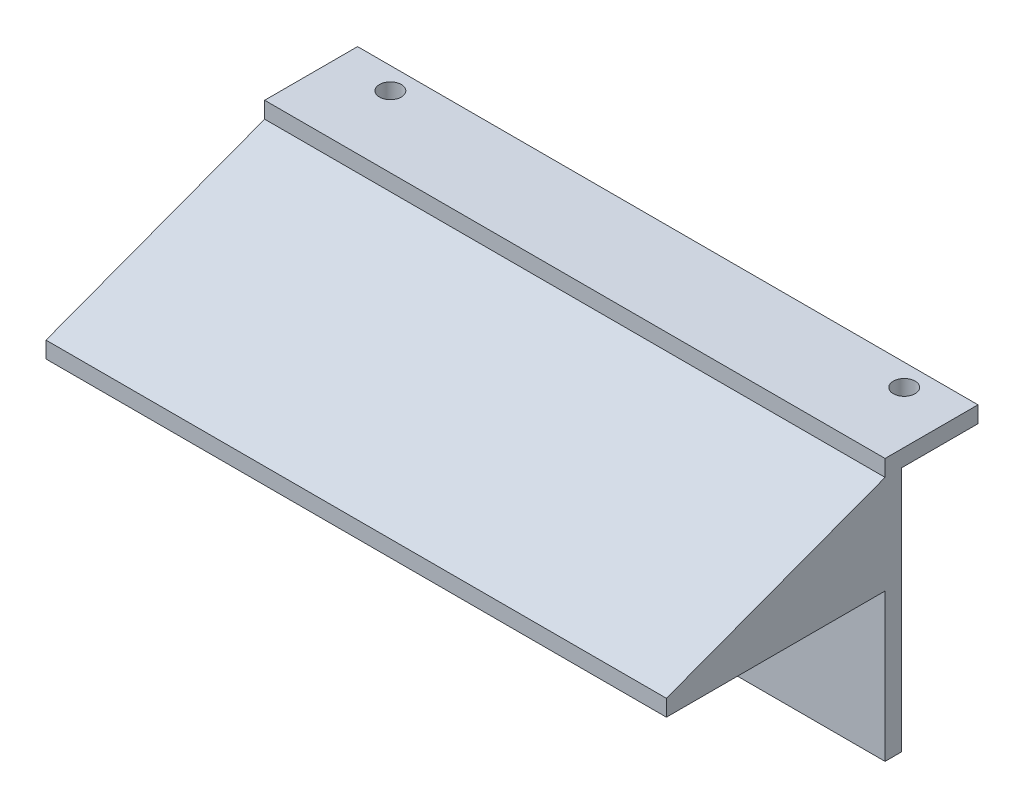
ISO-10303-21;
HEADER;
FILE_DESCRIPTION(('STEP AP214'),'2;1');
FILE_NAME('part.step','',(''),(''),'','','');
FILE_SCHEMA(('AUTOMOTIVE_DESIGN { 1 0 10303 214 1 1 1 1 }'));
ENDSEC;
DATA;
#1=APPLICATION_CONTEXT('core data for automotive mechanical design processes');
#2=APPLICATION_PROTOCOL_DEFINITION('international standard','automotive_design',2000,#1);
#3=PRODUCT_CONTEXT('',#1,'mechanical');
#4=PRODUCT('Part','Part','',(#3));
#5=PRODUCT_RELATED_PRODUCT_CATEGORY('part','',(#4));
#6=PRODUCT_DEFINITION_FORMATION('','',#4);
#7=PRODUCT_DEFINITION_CONTEXT('part definition',#1,'design');
#8=PRODUCT_DEFINITION('design','',#6,#7);
#9=PRODUCT_DEFINITION_SHAPE('','',#8);
#10=(LENGTH_UNIT() NAMED_UNIT(*) SI_UNIT(.MILLI.,.METRE.));
#11=(NAMED_UNIT(*) PLANE_ANGLE_UNIT() SI_UNIT($,.RADIAN.));
#12=(NAMED_UNIT(*) SI_UNIT($,.STERADIAN.) SOLID_ANGLE_UNIT());
#13=UNCERTAINTY_MEASURE_WITH_UNIT(LENGTH_MEASURE(1.E-05),#10,'distance_accuracy_value','');
#14=(GEOMETRIC_REPRESENTATION_CONTEXT(3) GLOBAL_UNCERTAINTY_ASSIGNED_CONTEXT((#13)) GLOBAL_UNIT_ASSIGNED_CONTEXT((#10,
#11,#12)) REPRESENTATION_CONTEXT('',''));
#15=CARTESIAN_POINT('',(0.,0.,0.));
#16=DIRECTION('',(0.,0.,1.));
#17=DIRECTION('',(1.,0.,0.));
#18=AXIS2_PLACEMENT_3D('',#15,#16,#17);
#19=CARTESIAN_POINT('',(-39.3793601418237,3.,0.));
#20=DIRECTION('',(-1.,0.,0.));
#21=DIRECTION('',(0.,0.,1.));
#22=AXIS2_PLACEMENT_3D('',#19,#20,#21);
#23=PLANE('',#22);
#24=DIRECTION('',(0.,0.351123441588392,-0.936329177569045));
#25=VECTOR('',#24,1.);
#26=CARTESIAN_POINT('',(-39.3793601418237,-10.1224810513872,-3.79593039427022));
#27=LINE('',#26,#25);
#28=CARTESIAN_POINT('',(-39.3793601418237,-15.,9.21078680203047));
#29=VERTEX_POINT('',#28);
#30=CARTESIAN_POINT('',(-39.3793601418237,0.,-30.7892131979695));
#31=VERTEX_POINT('',#30);
#32=EDGE_CURVE('E213',#29,#31,#27,.T.);
#33=ORIENTED_EDGE('',*,*,#32,.F.);
#34=DIRECTION('',(0.,1.,0.));
#35=VECTOR('',#34,1.);
#36=CARTESIAN_POINT('',(-39.3793601418237,0.,9.21078680203047));
#37=LINE('',#36,#35);
#38=CARTESIAN_POINT('',(-39.3793601418237,-18.,9.21078680203047));
#39=VERTEX_POINT('',#38);
#40=EDGE_CURVE('E208',#39,#29,#37,.T.);
#41=ORIENTED_EDGE('',*,*,#40,.F.);
#42=DIRECTION('',(0.,0.,-1.));
#43=VECTOR('',#42,1.);
#44=CARTESIAN_POINT('',(-39.3793601418237,-18.,9.21078680203047));
#45=LINE('',#44,#43);
#46=CARTESIAN_POINT('',(-39.3793601418237,-18.,-30.7892131979695));
#47=VERTEX_POINT('',#46);
#48=EDGE_CURVE('E134',#39,#47,#45,.T.);
#49=ORIENTED_EDGE('',*,*,#48,.T.);
#50=DIRECTION('',(0.,1.,0.));
#51=VECTOR('',#50,1.);
#52=CARTESIAN_POINT('',(-39.3793601418237,0.,-30.7892131979695));
#53=LINE('',#52,#51);
#54=CARTESIAN_POINT('',(-39.3793601418237,-45.,-30.7892131979695));
#55=VERTEX_POINT('',#54);
#56=EDGE_CURVE('E195',#55,#47,#53,.T.);
#57=ORIENTED_EDGE('',*,*,#56,.F.);
#58=DIRECTION('',(0.,0.,-1.));
#59=VECTOR('',#58,1.);
#60=CARTESIAN_POINT('',(-39.3793601418237,-45.,-30.7892131979695));
#61=LINE('',#60,#59);
#62=CARTESIAN_POINT('',(-39.3793601418237,-45.,-33.7892131979695));
#63=VERTEX_POINT('',#62);
#64=EDGE_CURVE('E122',#55,#63,#61,.T.);
#65=ORIENTED_EDGE('',*,*,#64,.T.);
#66=DIRECTION('',(0.,1.,0.));
#67=VECTOR('',#66,1.);
#68=CARTESIAN_POINT('',(-39.3793601418237,0.,-33.7892131979695));
#69=LINE('',#68,#67);
#70=CARTESIAN_POINT('',(-39.3793601418237,0.,-33.7892131979695));
#71=VERTEX_POINT('',#70);
#72=EDGE_CURVE('E89',#63,#71,#69,.T.);
#73=ORIENTED_EDGE('',*,*,#72,.T.);
#74=DIRECTION('',(0.,0.,-1.));
#75=VECTOR('',#74,1.);
#76=CARTESIAN_POINT('',(-39.3793601418237,0.,0.));
#77=LINE('',#76,#75);
#78=CARTESIAN_POINT('',(-39.3793601418237,0.,-47.7892131979695));
#79=VERTEX_POINT('',#78);
#80=EDGE_CURVE('E97',#71,#79,#77,.T.);
#81=ORIENTED_EDGE('',*,*,#80,.T.);
#82=DIRECTION('',(0.,-1.,0.));
#83=VECTOR('',#82,1.);
#84=CARTESIAN_POINT('',(-39.3793601418237,3.,-47.7892131979695));
#85=LINE('',#84,#83);
#86=CARTESIAN_POINT('',(-39.3793601418237,3.,-47.7892131979695));
#87=VERTEX_POINT('',#86);
#88=EDGE_CURVE('E11',#87,#79,#85,.T.);
#89=ORIENTED_EDGE('',*,*,#88,.F.);
#90=DIRECTION('',(0.,0.,-1.));
#91=VECTOR('',#90,1.);
#92=CARTESIAN_POINT('',(-39.3793601418237,3.,0.));
#93=LINE('',#92,#91);
#94=CARTESIAN_POINT('',(-39.3793601418237,3.,-30.7892131979695));
#95=VERTEX_POINT('',#94);
#96=EDGE_CURVE('E115',#95,#87,#93,.T.);
#97=ORIENTED_EDGE('',*,*,#96,.F.);
#98=EDGE_CURVE('E151',#31,#95,#53,.T.);
#99=ORIENTED_EDGE('',*,*,#98,.F.);
#100=EDGE_LOOP('',(#33,#41,#49,#57,#65,#73,#81,#89,#97,#99));
#101=FACE_BOUND('',#100,.T.);
#102=ADVANCED_FACE('F34',(#101),#23,.F.);
#103=CARTESIAN_POINT('',(-152.879360141824,3.,0.));
#104=DIRECTION('',(-1.,0.,0.));
#105=DIRECTION('',(0.,0.,1.));
#106=AXIS2_PLACEMENT_3D('',#103,#104,#105);
#107=PLANE('',#106);
#108=DIRECTION('',(0.,-1.,0.));
#109=VECTOR('',#108,1.);
#110=CARTESIAN_POINT('',(-152.879360141824,0.,9.21078680203047));
#111=LINE('',#110,#109);
#112=CARTESIAN_POINT('',(-152.879360141824,-15.,9.21078680203047));
#113=VERTEX_POINT('',#112);
#114=CARTESIAN_POINT('',(-152.879360141824,-18.,9.21078680203047));
#115=VERTEX_POINT('',#114);
#116=EDGE_CURVE('E170',#113,#115,#111,.T.);
#117=ORIENTED_EDGE('',*,*,#116,.F.);
#118=DIRECTION('',(0.,0.351123441588392,-0.936329177569045));
#119=VECTOR('',#118,1.);
#120=CARTESIAN_POINT('',(-152.879360141824,-10.1224810513872,-3.79593039427022));
#121=LINE('',#120,#119);
#122=CARTESIAN_POINT('',(-152.879360141824,0.,-30.7892131979695));
#123=VERTEX_POINT('',#122);
#124=EDGE_CURVE('E49',#113,#123,#121,.T.);
#125=ORIENTED_EDGE('',*,*,#124,.T.);
#126=DIRECTION('',(0.,-1.,0.));
#127=VECTOR('',#126,1.);
#128=CARTESIAN_POINT('',(-152.879360141824,0.,-30.7892131979695));
#129=LINE('',#128,#127);
#130=CARTESIAN_POINT('',(-152.879360141824,3.,-30.7892131979695));
#131=VERTEX_POINT('',#130);
#132=EDGE_CURVE('E140',#131,#123,#129,.T.);
#133=ORIENTED_EDGE('',*,*,#132,.F.);
#134=DIRECTION('',(0.,0.,-1.));
#135=VECTOR('',#134,1.);
#136=CARTESIAN_POINT('',(-152.879360141824,3.,0.));
#137=LINE('',#136,#135);
#138=CARTESIAN_POINT('',(-152.879360141824,3.,-47.7892131979695));
#139=VERTEX_POINT('',#138);
#140=EDGE_CURVE('E112',#131,#139,#137,.T.);
#141=ORIENTED_EDGE('',*,*,#140,.T.);
#142=DIRECTION('',(0.,-1.,0.));
#143=VECTOR('',#142,1.);
#144=CARTESIAN_POINT('',(-152.879360141824,3.,-47.7892131979695));
#145=LINE('',#144,#143);
#146=CARTESIAN_POINT('',(-152.879360141824,0.,-47.7892131979695));
#147=VERTEX_POINT('',#146);
#148=EDGE_CURVE('E42',#139,#147,#145,.T.);
#149=ORIENTED_EDGE('',*,*,#148,.T.);
#150=DIRECTION('',(0.,0.,-1.));
#151=VECTOR('',#150,1.);
#152=CARTESIAN_POINT('',(-152.879360141824,0.,0.));
#153=LINE('',#152,#151);
#154=CARTESIAN_POINT('',(-152.879360141824,0.,-33.7892131979695));
#155=VERTEX_POINT('',#154);
#156=EDGE_CURVE('E95',#155,#147,#153,.T.);
#157=ORIENTED_EDGE('',*,*,#156,.F.);
#158=DIRECTION('',(0.,-1.,0.));
#159=VECTOR('',#158,1.);
#160=CARTESIAN_POINT('',(-152.879360141824,0.,-33.7892131979695));
#161=LINE('',#160,#159);
#162=CARTESIAN_POINT('',(-152.879360141824,-45.,-33.7892131979695));
#163=VERTEX_POINT('',#162);
#164=EDGE_CURVE('E75',#155,#163,#161,.T.);
#165=ORIENTED_EDGE('',*,*,#164,.T.);
#166=DIRECTION('',(0.,0.,-1.));
#167=VECTOR('',#166,1.);
#168=CARTESIAN_POINT('',(-152.879360141824,-45.,-30.7892131979695));
#169=LINE('',#168,#167);
#170=CARTESIAN_POINT('',(-152.879360141824,-45.,-30.7892131979695));
#171=VERTEX_POINT('',#170);
#172=EDGE_CURVE('E138',#171,#163,#169,.T.);
#173=ORIENTED_EDGE('',*,*,#172,.F.);
#174=CARTESIAN_POINT('',(-152.879360141824,-18.,-30.7892131979695));
#175=VERTEX_POINT('',#174);
#176=EDGE_CURVE('E194',#175,#171,#129,.T.);
#177=ORIENTED_EDGE('',*,*,#176,.F.);
#178=DIRECTION('',(0.,0.,-1.));
#179=VECTOR('',#178,1.);
#180=CARTESIAN_POINT('',(-152.879360141824,-18.,9.21078680203047));
#181=LINE('',#180,#179);
#182=EDGE_CURVE('E183',#115,#175,#181,.T.);
#183=ORIENTED_EDGE('',*,*,#182,.F.);
#184=EDGE_LOOP('',(#117,#125,#133,#141,#149,#157,#165,#173,#177,#183));
#185=FACE_BOUND('',#184,.T.);
#186=ADVANCED_FACE('F101',(#185),#107,.T.);
#187=CARTESIAN_POINT('',(0.,0.,9.21078680203047));
#188=DIRECTION('',(0.,0.,1.));
#189=DIRECTION('',(1.,0.,0.));
#190=AXIS2_PLACEMENT_3D('',#187,#188,#189);
#191=PLANE('',#190);
#192=ORIENTED_EDGE('',*,*,#40,.T.);
#193=DIRECTION('',(-1.,0.,0.));
#194=VECTOR('',#193,1.);
#195=CARTESIAN_POINT('',(-39.3793601418237,-15.,9.21078680203047));
#196=LINE('',#195,#194);
#197=EDGE_CURVE('E197',#29,#113,#196,.T.);
#198=ORIENTED_EDGE('',*,*,#197,.T.);
#199=ORIENTED_EDGE('',*,*,#116,.T.);
#200=DIRECTION('',(-1.,0.,0.));
#201=VECTOR('',#200,1.);
#202=CARTESIAN_POINT('',(0.,-18.,9.21078680203047));
#203=LINE('',#202,#201);
#204=EDGE_CURVE('E188',#39,#115,#203,.T.);
#205=ORIENTED_EDGE('',*,*,#204,.F.);
#206=EDGE_LOOP('',(#192,#198,#199,#205));
#207=FACE_BOUND('',#206,.T.);
#208=ADVANCED_FACE('F233',(#207),#191,.T.);
#209=CARTESIAN_POINT('',(0.,0.,-30.7892131979695));
#210=DIRECTION('',(0.,0.,1.));
#211=DIRECTION('',(1.,0.,0.));
#212=AXIS2_PLACEMENT_3D('',#209,#210,#211);
#213=PLANE('',#212);
#214=ORIENTED_EDGE('',*,*,#56,.T.);
#215=DIRECTION('',(-1.,0.,0.));
#216=VECTOR('',#215,1.);
#217=CARTESIAN_POINT('',(0.,-18.,-30.7892131979695));
#218=LINE('',#217,#216);
#219=EDGE_CURVE('E186',#47,#175,#218,.T.);
#220=ORIENTED_EDGE('',*,*,#219,.T.);
#221=ORIENTED_EDGE('',*,*,#176,.T.);
#222=DIRECTION('',(-1.,0.,0.));
#223=VECTOR('',#222,1.);
#224=CARTESIAN_POINT('',(0.,-45.,-30.7892131979695));
#225=LINE('',#224,#223);
#226=EDGE_CURVE('E88',#55,#171,#225,.T.);
#227=ORIENTED_EDGE('',*,*,#226,.F.);
#228=EDGE_LOOP('',(#214,#220,#221,#227));
#229=FACE_BOUND('',#228,.T.);
#230=ADVANCED_FACE('F192',(#229),#213,.T.);
#231=ORIENTED_EDGE('',*,*,#132,.T.);
#232=DIRECTION('',(1.,0.,0.));
#233=VECTOR('',#232,1.);
#234=CARTESIAN_POINT('',(0.,0.,-30.7892131979695));
#235=LINE('',#234,#233);
#236=EDGE_CURVE('E196',#123,#31,#235,.T.);
#237=ORIENTED_EDGE('',*,*,#236,.T.);
#238=ORIENTED_EDGE('',*,*,#98,.T.);
#239=DIRECTION('',(-1.,0.,0.));
#240=VECTOR('',#239,1.);
#241=CARTESIAN_POINT('',(0.,3.,-30.7892131979695));
#242=LINE('',#241,#240);
#243=EDGE_CURVE('E147',#95,#131,#242,.T.);
#244=ORIENTED_EDGE('',*,*,#243,.T.);
#245=EDGE_LOOP('',(#231,#237,#238,#244));
#246=FACE_BOUND('',#245,.T.);
#247=ADVANCED_FACE('F221',(#246),#213,.T.);
#248=CARTESIAN_POINT('',(0.,3.,-47.7892131979695));
#249=DIRECTION('',(0.,0.,1.));
#250=DIRECTION('',(1.,0.,0.));
#251=AXIS2_PLACEMENT_3D('',#248,#249,#250);
#252=PLANE('',#251);
#253=DIRECTION('',(-1.,0.,0.));
#254=VECTOR('',#253,1.);
#255=CARTESIAN_POINT('',(0.,0.,-47.7892131979695));
#256=LINE('',#255,#254);
#257=EDGE_CURVE('E105',#79,#147,#256,.T.);
#258=ORIENTED_EDGE('',*,*,#257,.T.);
#259=ORIENTED_EDGE('',*,*,#148,.F.);
#260=DIRECTION('',(-1.,0.,0.));
#261=VECTOR('',#260,1.);
#262=CARTESIAN_POINT('',(0.,3.,-47.7892131979695));
#263=LINE('',#262,#261);
#264=EDGE_CURVE('E58',#87,#139,#263,.T.);
#265=ORIENTED_EDGE('',*,*,#264,.F.);
#266=ORIENTED_EDGE('',*,*,#88,.T.);
#267=EDGE_LOOP('',(#258,#259,#265,#266));
#268=FACE_BOUND('',#267,.T.);
#269=ADVANCED_FACE('F224',(#268),#252,.F.);
#270=CARTESIAN_POINT('',(-48.8793601418237,3.,-43.7892131979695));
#271=DIRECTION('',(0.,-1.,0.));
#272=DIRECTION('',(0.,0.,-1.));
#273=AXIS2_PLACEMENT_3D('',#270,#271,#272);
#274=CYLINDRICAL_SURFACE('',#273,2.);
#275=CARTESIAN_POINT('',(-48.8793601418237,3.,-43.7892131979695));
#276=DIRECTION('',(0.,1.,0.));
#277=DIRECTION('',(0.,0.,1.));
#278=AXIS2_PLACEMENT_3D('',#275,#276,#277);
#279=CIRCLE('',#278,2.);
#280=CARTESIAN_POINT('',(-48.8793601418237,3.,-41.7892131979695));
#281=VERTEX_POINT('',#280);
#282=EDGE_CURVE('E108',#281,#281,#279,.T.);
#283=ORIENTED_EDGE('',*,*,#282,.T.);
#284=EDGE_LOOP('',(#283));
#285=FACE_BOUND('',#284,.T.);
#286=CARTESIAN_POINT('',(-48.8793601418237,0.,-43.7892131979695));
#287=DIRECTION('',(0.,1.,0.));
#288=DIRECTION('',(0.,0.,1.));
#289=AXIS2_PLACEMENT_3D('',#286,#287,#288);
#290=CIRCLE('',#289,2.);
#291=CARTESIAN_POINT('',(-48.8793601418237,0.,-41.7892131979695));
#292=VERTEX_POINT('',#291);
#293=EDGE_CURVE('E98',#292,#292,#290,.T.);
#294=ORIENTED_EDGE('',*,*,#293,.F.);
#295=EDGE_LOOP('',(#294));
#296=FACE_BOUND('',#295,.T.);
#297=ADVANCED_FACE('F230',(#285,#296),#274,.F.);
#298=CARTESIAN_POINT('',(-142.879360141824,3.,-43.7892131979695));
#299=DIRECTION('',(0.,-1.,0.));
#300=DIRECTION('',(0.,0.,-1.));
#301=AXIS2_PLACEMENT_3D('',#298,#299,#300);
#302=CYLINDRICAL_SURFACE('',#301,2.);
#303=CARTESIAN_POINT('',(-142.879360141824,3.,-43.7892131979695));
#304=DIRECTION('',(0.,1.,0.));
#305=DIRECTION('',(0.,0.,1.));
#306=AXIS2_PLACEMENT_3D('',#303,#304,#305);
#307=CIRCLE('',#306,2.);
#308=CARTESIAN_POINT('',(-142.879360141824,3.,-41.7892131979695));
#309=VERTEX_POINT('',#308);
#310=EDGE_CURVE('E104',#309,#309,#307,.T.);
#311=ORIENTED_EDGE('',*,*,#310,.T.);
#312=EDGE_LOOP('',(#311));
#313=FACE_BOUND('',#312,.T.);
#314=CARTESIAN_POINT('',(-142.879360141824,0.,-43.7892131979695));
#315=DIRECTION('',(0.,1.,0.));
#316=DIRECTION('',(0.,0.,1.));
#317=AXIS2_PLACEMENT_3D('',#314,#315,#316);
#318=CIRCLE('',#317,2.);
#319=CARTESIAN_POINT('',(-142.879360141824,0.,-41.7892131979695));
#320=VERTEX_POINT('',#319);
#321=EDGE_CURVE('E119',#320,#320,#318,.T.);
#322=ORIENTED_EDGE('',*,*,#321,.F.);
#323=EDGE_LOOP('',(#322));
#324=FACE_BOUND('',#323,.T.);
#325=ADVANCED_FACE('F36',(#313,#324),#302,.F.);
#326=CARTESIAN_POINT('',(0.,3.,0.));
#327=DIRECTION('',(0.,1.,0.));
#328=DIRECTION('',(0.,0.,1.));
#329=AXIS2_PLACEMENT_3D('',#326,#327,#328);
#330=PLANE('',#329);
#331=ORIENTED_EDGE('',*,*,#310,.F.);
#332=EDGE_LOOP('',(#331));
#333=FACE_BOUND('',#332,.T.);
#334=ORIENTED_EDGE('',*,*,#282,.F.);
#335=EDGE_LOOP('',(#334));
#336=FACE_BOUND('',#335,.T.);
#337=ORIENTED_EDGE('',*,*,#140,.F.);
#338=ORIENTED_EDGE('',*,*,#243,.F.);
#339=ORIENTED_EDGE('',*,*,#96,.T.);
#340=ORIENTED_EDGE('',*,*,#264,.T.);
#341=EDGE_LOOP('',(#337,#338,#339,#340));
#342=FACE_BOUND('',#341,.T.);
#343=ADVANCED_FACE('F144',(#333,#336,#342),#330,.T.);
#344=CARTESIAN_POINT('',(0.,0.,0.));
#345=DIRECTION('',(0.,1.,0.));
#346=DIRECTION('',(0.,0.,1.));
#347=AXIS2_PLACEMENT_3D('',#344,#345,#346);
#348=PLANE('',#347);
#349=ORIENTED_EDGE('',*,*,#321,.T.);
#350=EDGE_LOOP('',(#349));
#351=FACE_BOUND('',#350,.T.);
#352=ORIENTED_EDGE('',*,*,#293,.T.);
#353=EDGE_LOOP('',(#352));
#354=FACE_BOUND('',#353,.T.);
#355=DIRECTION('',(-1.,0.,0.));
#356=VECTOR('',#355,1.);
#357=CARTESIAN_POINT('',(0.,0.,-33.7892131979695));
#358=LINE('',#357,#356);
#359=EDGE_CURVE('E79',#71,#155,#358,.T.);
#360=ORIENTED_EDGE('',*,*,#359,.T.);
#361=ORIENTED_EDGE('',*,*,#156,.T.);
#362=ORIENTED_EDGE('',*,*,#257,.F.);
#363=ORIENTED_EDGE('',*,*,#80,.F.);
#364=EDGE_LOOP('',(#360,#361,#362,#363));
#365=FACE_BOUND('',#364,.T.);
#366=ADVANCED_FACE('F94',(#351,#354,#365),#348,.F.);
#367=CARTESIAN_POINT('',(0.,-45.,-30.7892131979695));
#368=DIRECTION('',(0.,-1.,0.));
#369=DIRECTION('',(0.,0.,-1.));
#370=AXIS2_PLACEMENT_3D('',#367,#368,#369);
#371=PLANE('',#370);
#372=DIRECTION('',(-1.,0.,0.));
#373=VECTOR('',#372,1.);
#374=CARTESIAN_POINT('',(0.,-45.,-33.7892131979695));
#375=LINE('',#374,#373);
#376=EDGE_CURVE('E83',#63,#163,#375,.T.);
#377=ORIENTED_EDGE('',*,*,#376,.F.);
#378=ORIENTED_EDGE('',*,*,#64,.F.);
#379=ORIENTED_EDGE('',*,*,#226,.T.);
#380=ORIENTED_EDGE('',*,*,#172,.T.);
#381=EDGE_LOOP('',(#377,#378,#379,#380));
#382=FACE_BOUND('',#381,.T.);
#383=ADVANCED_FACE('F253',(#382),#371,.T.);
#384=CARTESIAN_POINT('',(0.,0.,-33.7892131979695));
#385=DIRECTION('',(0.,0.,1.));
#386=DIRECTION('',(1.,0.,0.));
#387=AXIS2_PLACEMENT_3D('',#384,#385,#386);
#388=PLANE('',#387);
#389=ORIENTED_EDGE('',*,*,#359,.F.);
#390=ORIENTED_EDGE('',*,*,#72,.F.);
#391=ORIENTED_EDGE('',*,*,#376,.T.);
#392=ORIENTED_EDGE('',*,*,#164,.F.);
#393=EDGE_LOOP('',(#389,#390,#391,#392));
#394=FACE_BOUND('',#393,.T.);
#395=ADVANCED_FACE('F77',(#394),#388,.F.);
#396=CARTESIAN_POINT('',(0.,-18.,9.21078680203047));
#397=DIRECTION('',(0.,-1.,0.));
#398=DIRECTION('',(0.,0.,-1.));
#399=AXIS2_PLACEMENT_3D('',#396,#397,#398);
#400=PLANE('',#399);
#401=ORIENTED_EDGE('',*,*,#219,.F.);
#402=ORIENTED_EDGE('',*,*,#48,.F.);
#403=ORIENTED_EDGE('',*,*,#204,.T.);
#404=ORIENTED_EDGE('',*,*,#182,.T.);
#405=EDGE_LOOP('',(#401,#402,#403,#404));
#406=FACE_BOUND('',#405,.T.);
#407=ADVANCED_FACE('F185',(#406),#400,.T.);
#408=CARTESIAN_POINT('',(-39.3793601418237,-10.1224810513872,-3.79593039427022));
#409=DIRECTION('',(0.,0.936329177569045,0.351123441588392));
#410=DIRECTION('',(0.,-0.351123441588392,0.936329177569045));
#411=AXIS2_PLACEMENT_3D('',#408,#409,#410);
#412=PLANE('',#411);
#413=ORIENTED_EDGE('',*,*,#124,.F.);
#414=ORIENTED_EDGE('',*,*,#197,.F.);
#415=ORIENTED_EDGE('',*,*,#32,.T.);
#416=ORIENTED_EDGE('',*,*,#236,.F.);
#417=EDGE_LOOP('',(#413,#414,#415,#416));
#418=FACE_BOUND('',#417,.T.);
#419=ADVANCED_FACE('F216',(#418),#412,.T.);
#420=CLOSED_SHELL('',(#102,#186,#208,#230,#247,#269,#297,#325,#343,#366,#383,#395,#407,#419));
#421=MANIFOLD_SOLID_BREP('B2',#420);
#422=ADVANCED_BREP_SHAPE_REPRESENTATION('',(#18,#421),#14);
#423=SHAPE_DEFINITION_REPRESENTATION(#9,#422);
ENDSEC;
END-ISO-10303-21;
